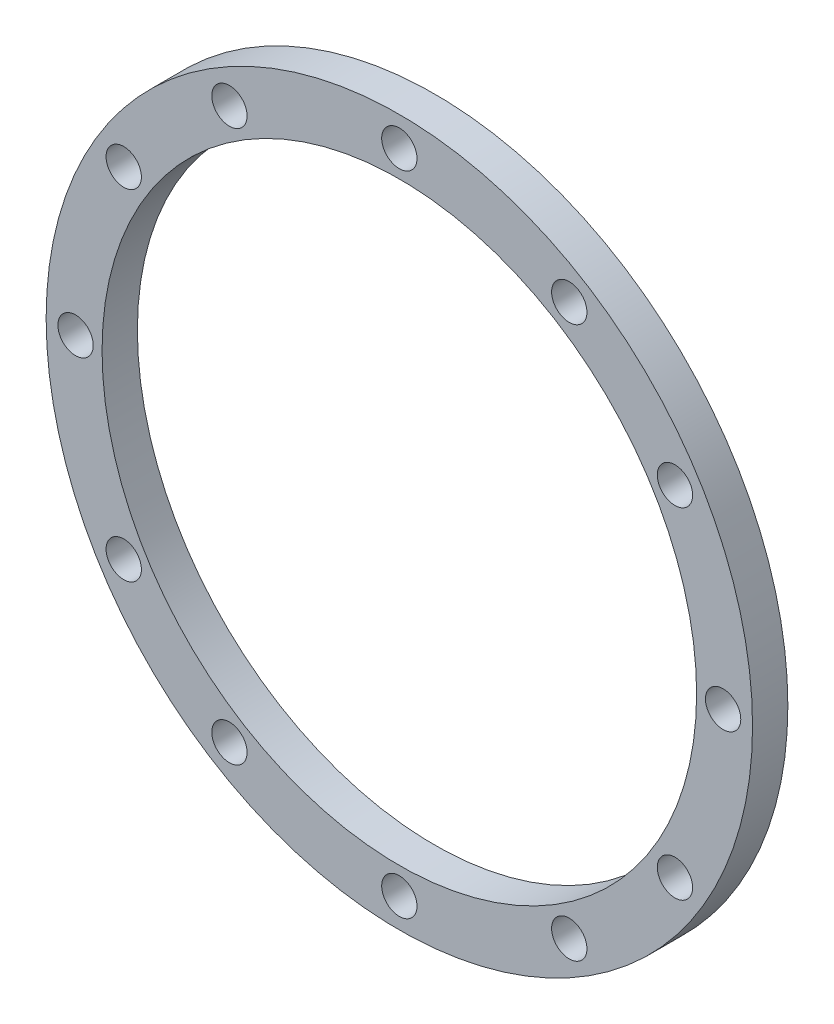
ISO-10303-21;
HEADER;
FILE_DESCRIPTION(('STEP AP214'),'2;1');
FILE_NAME('part.step','',(''),(''),'','','');
FILE_SCHEMA(('AUTOMOTIVE_DESIGN { 1 0 10303 214 1 1 1 1 }'));
ENDSEC;
DATA;
#1=APPLICATION_CONTEXT('core data for automotive mechanical design processes');
#2=APPLICATION_PROTOCOL_DEFINITION('international standard','automotive_design',2000,#1);
#3=PRODUCT_CONTEXT('',#1,'mechanical');
#4=PRODUCT('Part','Part','',(#3));
#5=PRODUCT_RELATED_PRODUCT_CATEGORY('part','',(#4));
#6=PRODUCT_DEFINITION_FORMATION('','',#4);
#7=PRODUCT_DEFINITION_CONTEXT('part definition',#1,'design');
#8=PRODUCT_DEFINITION('design','',#6,#7);
#9=PRODUCT_DEFINITION_SHAPE('','',#8);
#10=(LENGTH_UNIT() NAMED_UNIT(*) SI_UNIT(.MILLI.,.METRE.));
#11=(NAMED_UNIT(*) PLANE_ANGLE_UNIT() SI_UNIT($,.RADIAN.));
#12=(NAMED_UNIT(*) SI_UNIT($,.STERADIAN.) SOLID_ANGLE_UNIT());
#13=UNCERTAINTY_MEASURE_WITH_UNIT(LENGTH_MEASURE(1.E-05),#10,'distance_accuracy_value','');
#14=(GEOMETRIC_REPRESENTATION_CONTEXT(3) GLOBAL_UNCERTAINTY_ASSIGNED_CONTEXT((#13)) GLOBAL_UNIT_ASSIGNED_CONTEXT((#10,
#11,#12)) REPRESENTATION_CONTEXT('',''));
#15=CARTESIAN_POINT('',(0.,0.,0.));
#16=DIRECTION('',(0.,0.,1.));
#17=DIRECTION('',(1.,0.,0.));
#18=AXIS2_PLACEMENT_3D('',#15,#16,#17);
#19=CARTESIAN_POINT('',(0.,0.,30.));
#20=DIRECTION('',(0.,0.,1.));
#21=DIRECTION('',(1.,0.,0.));
#22=AXIS2_PLACEMENT_3D('',#19,#20,#21);
#23=PLANE('',#22);
#24=CARTESIAN_POINT('',(-234.090909090909,144.31370787625,30.));
#25=DIRECTION('',(0.,0.,1.));
#26=DIRECTION('',(1.,0.,0.));
#27=AXIS2_PLACEMENT_3D('',#24,#25,#26);
#28=CIRCLE('',#27,15.);
#29=CARTESIAN_POINT('',(-219.090909090909,144.31370787625,30.));
#30=VERTEX_POINT('',#29);
#31=EDGE_CURVE('E98',#30,#30,#28,.T.);
#32=ORIENTED_EDGE('',*,*,#31,.F.);
#33=EDGE_LOOP('',(#32));
#34=FACE_BOUND('',#33,.T.);
#35=CARTESIAN_POINT('',(144.31370787625,-234.090909090909,30.));
#36=DIRECTION('',(0.,0.,1.));
#37=DIRECTION('',(1.,0.,0.));
#38=AXIS2_PLACEMENT_3D('',#35,#36,#37);
#39=CIRCLE('',#38,15.);
#40=CARTESIAN_POINT('',(159.31370787625,-234.090909090909,30.));
#41=VERTEX_POINT('',#40);
#42=EDGE_CURVE('E92',#41,#41,#39,.T.);
#43=ORIENTED_EDGE('',*,*,#42,.F.);
#44=EDGE_LOOP('',(#43));
#45=FACE_BOUND('',#44,.T.);
#46=CARTESIAN_POINT('',(234.090909090909,-144.31370787625,30.));
#47=DIRECTION('',(0.,0.,1.));
#48=DIRECTION('',(1.,0.,0.));
#49=AXIS2_PLACEMENT_3D('',#46,#47,#48);
#50=CIRCLE('',#49,15.);
#51=CARTESIAN_POINT('',(249.090909090909,-144.31370787625,30.));
#52=VERTEX_POINT('',#51);
#53=EDGE_CURVE('E85',#52,#52,#50,.T.);
#54=ORIENTED_EDGE('',*,*,#53,.F.);
#55=EDGE_LOOP('',(#54));
#56=FACE_BOUND('',#55,.T.);
#57=CARTESIAN_POINT('',(234.090909090909,144.31370787625,30.));
#58=DIRECTION('',(0.,0.,1.));
#59=DIRECTION('',(1.,0.,0.));
#60=AXIS2_PLACEMENT_3D('',#57,#58,#59);
#61=CIRCLE('',#60,15.);
#62=CARTESIAN_POINT('',(249.090909090909,144.31370787625,30.));
#63=VERTEX_POINT('',#62);
#64=EDGE_CURVE('E115',#63,#63,#61,.T.);
#65=ORIENTED_EDGE('',*,*,#64,.F.);
#66=EDGE_LOOP('',(#65));
#67=FACE_BOUND('',#66,.T.);
#68=CARTESIAN_POINT('',(-144.31370787625,234.090909090909,30.));
#69=DIRECTION('',(0.,0.,1.));
#70=DIRECTION('',(1.,0.,0.));
#71=AXIS2_PLACEMENT_3D('',#68,#69,#70);
#72=CIRCLE('',#71,15.);
#73=CARTESIAN_POINT('',(-129.31370787625,234.090909090909,30.));
#74=VERTEX_POINT('',#73);
#75=EDGE_CURVE('E109',#74,#74,#72,.T.);
#76=ORIENTED_EDGE('',*,*,#75,.F.);
#77=EDGE_LOOP('',(#76));
#78=FACE_BOUND('',#77,.T.);
#79=CARTESIAN_POINT('',(144.31370787625,234.090909090909,30.));
#80=DIRECTION('',(0.,0.,1.));
#81=DIRECTION('',(1.,0.,0.));
#82=AXIS2_PLACEMENT_3D('',#79,#80,#81);
#83=CIRCLE('',#82,15.);
#84=CARTESIAN_POINT('',(159.31370787625,234.090909090909,30.));
#85=VERTEX_POINT('',#84);
#86=EDGE_CURVE('E103',#85,#85,#83,.T.);
#87=ORIENTED_EDGE('',*,*,#86,.F.);
#88=EDGE_LOOP('',(#87));
#89=FACE_BOUND('',#88,.T.);
#90=CARTESIAN_POINT('',(-234.090909090909,-144.31370787625,30.));
#91=DIRECTION('',(0.,0.,1.));
#92=DIRECTION('',(1.,0.,0.));
#93=AXIS2_PLACEMENT_3D('',#90,#91,#92);
#94=CIRCLE('',#93,15.);
#95=CARTESIAN_POINT('',(-219.090909090909,-144.31370787625,30.));
#96=VERTEX_POINT('',#95);
#97=EDGE_CURVE('E55',#96,#96,#94,.T.);
#98=ORIENTED_EDGE('',*,*,#97,.F.);
#99=EDGE_LOOP('',(#98));
#100=FACE_BOUND('',#99,.T.);
#101=CARTESIAN_POINT('',(-144.31370787625,-234.090909090909,30.));
#102=DIRECTION('',(0.,0.,1.));
#103=DIRECTION('',(1.,0.,0.));
#104=AXIS2_PLACEMENT_3D('',#101,#102,#103);
#105=CIRCLE('',#104,15.);
#106=CARTESIAN_POINT('',(-129.31370787625,-234.090909090909,30.));
#107=VERTEX_POINT('',#106);
#108=EDGE_CURVE('E62',#107,#107,#105,.T.);
#109=ORIENTED_EDGE('',*,*,#108,.F.);
#110=EDGE_LOOP('',(#109));
#111=FACE_BOUND('',#110,.T.);
#112=CARTESIAN_POINT('',(0.,-275.,30.));
#113=DIRECTION('',(0.,0.,1.));
#114=DIRECTION('',(1.,0.,0.));
#115=AXIS2_PLACEMENT_3D('',#112,#113,#114);
#116=CIRCLE('',#115,15.);
#117=CARTESIAN_POINT('',(15.,-275.,30.));
#118=VERTEX_POINT('',#117);
#119=EDGE_CURVE('E68',#118,#118,#116,.T.);
#120=ORIENTED_EDGE('',*,*,#119,.F.);
#121=EDGE_LOOP('',(#120));
#122=FACE_BOUND('',#121,.T.);
#123=CARTESIAN_POINT('',(-275.,0.,30.));
#124=DIRECTION('',(0.,0.,1.));
#125=DIRECTION('',(1.,0.,0.));
#126=AXIS2_PLACEMENT_3D('',#123,#124,#125);
#127=CIRCLE('',#126,15.);
#128=CARTESIAN_POINT('',(-260.,0.,30.));
#129=VERTEX_POINT('',#128);
#130=EDGE_CURVE('E74',#129,#129,#127,.T.);
#131=ORIENTED_EDGE('',*,*,#130,.F.);
#132=EDGE_LOOP('',(#131));
#133=FACE_BOUND('',#132,.T.);
#134=CARTESIAN_POINT('',(275.,0.,30.));
#135=DIRECTION('',(0.,0.,1.));
#136=DIRECTION('',(1.,0.,0.));
#137=AXIS2_PLACEMENT_3D('',#134,#135,#136);
#138=CIRCLE('',#137,15.);
#139=CARTESIAN_POINT('',(290.,0.,30.));
#140=VERTEX_POINT('',#139);
#141=EDGE_CURVE('E80',#140,#140,#138,.T.);
#142=ORIENTED_EDGE('',*,*,#141,.F.);
#143=EDGE_LOOP('',(#142));
#144=FACE_BOUND('',#143,.T.);
#145=CARTESIAN_POINT('',(0.,275.,30.));
#146=DIRECTION('',(0.,0.,1.));
#147=DIRECTION('',(1.,0.,0.));
#148=AXIS2_PLACEMENT_3D('',#145,#146,#147);
#149=CIRCLE('',#148,15.);
#150=CARTESIAN_POINT('',(15.,275.,30.));
#151=VERTEX_POINT('',#150);
#152=EDGE_CURVE('E49',#151,#151,#149,.T.);
#153=ORIENTED_EDGE('',*,*,#152,.F.);
#154=EDGE_LOOP('',(#153));
#155=FACE_BOUND('',#154,.T.);
#156=CARTESIAN_POINT('',(0.,0.,30.));
#157=DIRECTION('',(0.,0.,1.));
#158=DIRECTION('',(1.,0.,0.));
#159=AXIS2_PLACEMENT_3D('',#156,#157,#158);
#160=CIRCLE('',#159,300.);
#161=CARTESIAN_POINT('',(300.,0.,30.));
#162=VERTEX_POINT('',#161);
#163=EDGE_CURVE('E10',#162,#162,#160,.T.);
#164=ORIENTED_EDGE('',*,*,#163,.T.);
#165=EDGE_LOOP('',(#164));
#166=FACE_BOUND('',#165,.T.);
#167=CARTESIAN_POINT('',(0.,0.,30.));
#168=DIRECTION('',(0.,0.,1.));
#169=DIRECTION('',(1.,0.,0.));
#170=AXIS2_PLACEMENT_3D('',#167,#168,#169);
#171=CIRCLE('',#170,252.5);
#172=CARTESIAN_POINT('',(252.5,0.,30.));
#173=VERTEX_POINT('',#172);
#174=EDGE_CURVE('E41',#173,#173,#171,.T.);
#175=ORIENTED_EDGE('',*,*,#174,.F.);
#176=EDGE_LOOP('',(#175));
#177=FACE_BOUND('',#176,.T.);
#178=ADVANCED_FACE('F30',(#34,#45,#56,#67,#78,#89,#100,#111,#122,#133,#144,#155,#166,#177),#23,.T.);
#179=CARTESIAN_POINT('',(0.,0.,0.));
#180=DIRECTION('',(0.,0.,1.));
#181=DIRECTION('',(1.,0.,0.));
#182=AXIS2_PLACEMENT_3D('',#179,#180,#181);
#183=PLANE('',#182);
#184=CARTESIAN_POINT('',(-234.090909090909,144.31370787625,0.));
#185=DIRECTION('',(0.,0.,1.));
#186=DIRECTION('',(1.,0.,0.));
#187=AXIS2_PLACEMENT_3D('',#184,#185,#186);
#188=CIRCLE('',#187,15.);
#189=CARTESIAN_POINT('',(-219.090909090909,144.31370787625,0.));
#190=VERTEX_POINT('',#189);
#191=EDGE_CURVE('E59',#190,#190,#188,.T.);
#192=ORIENTED_EDGE('',*,*,#191,.T.);
#193=EDGE_LOOP('',(#192));
#194=FACE_BOUND('',#193,.T.);
#195=CARTESIAN_POINT('',(144.31370787625,-234.090909090909,0.));
#196=DIRECTION('',(0.,0.,1.));
#197=DIRECTION('',(1.,0.,0.));
#198=AXIS2_PLACEMENT_3D('',#195,#196,#197);
#199=CIRCLE('',#198,15.);
#200=CARTESIAN_POINT('',(159.31370787625,-234.090909090909,0.));
#201=VERTEX_POINT('',#200);
#202=EDGE_CURVE('E95',#201,#201,#199,.T.);
#203=ORIENTED_EDGE('',*,*,#202,.T.);
#204=EDGE_LOOP('',(#203));
#205=FACE_BOUND('',#204,.T.);
#206=CARTESIAN_POINT('',(234.090909090909,-144.31370787625,0.));
#207=DIRECTION('',(0.,0.,1.));
#208=DIRECTION('',(1.,0.,0.));
#209=AXIS2_PLACEMENT_3D('',#206,#207,#208);
#210=CIRCLE('',#209,15.);
#211=CARTESIAN_POINT('',(249.090909090909,-144.31370787625,0.));
#212=VERTEX_POINT('',#211);
#213=EDGE_CURVE('E88',#212,#212,#210,.T.);
#214=ORIENTED_EDGE('',*,*,#213,.T.);
#215=EDGE_LOOP('',(#214));
#216=FACE_BOUND('',#215,.T.);
#217=CARTESIAN_POINT('',(234.090909090909,144.31370787625,0.));
#218=DIRECTION('',(0.,0.,1.));
#219=DIRECTION('',(1.,0.,0.));
#220=AXIS2_PLACEMENT_3D('',#217,#218,#219);
#221=CIRCLE('',#220,15.);
#222=CARTESIAN_POINT('',(249.090909090909,144.31370787625,0.));
#223=VERTEX_POINT('',#222);
#224=EDGE_CURVE('E89',#223,#223,#221,.T.);
#225=ORIENTED_EDGE('',*,*,#224,.T.);
#226=EDGE_LOOP('',(#225));
#227=FACE_BOUND('',#226,.T.);
#228=CARTESIAN_POINT('',(-144.31370787625,234.090909090909,0.));
#229=DIRECTION('',(0.,0.,1.));
#230=DIRECTION('',(1.,0.,0.));
#231=AXIS2_PLACEMENT_3D('',#228,#229,#230);
#232=CIRCLE('',#231,15.);
#233=CARTESIAN_POINT('',(-129.31370787625,234.090909090909,0.));
#234=VERTEX_POINT('',#233);
#235=EDGE_CURVE('E112',#234,#234,#232,.T.);
#236=ORIENTED_EDGE('',*,*,#235,.T.);
#237=EDGE_LOOP('',(#236));
#238=FACE_BOUND('',#237,.T.);
#239=CARTESIAN_POINT('',(144.31370787625,234.090909090909,0.));
#240=DIRECTION('',(0.,0.,1.));
#241=DIRECTION('',(1.,0.,0.));
#242=AXIS2_PLACEMENT_3D('',#239,#240,#241);
#243=CIRCLE('',#242,15.);
#244=CARTESIAN_POINT('',(159.31370787625,234.090909090909,0.));
#245=VERTEX_POINT('',#244);
#246=EDGE_CURVE('E106',#245,#245,#243,.T.);
#247=ORIENTED_EDGE('',*,*,#246,.T.);
#248=EDGE_LOOP('',(#247));
#249=FACE_BOUND('',#248,.T.);
#250=CARTESIAN_POINT('',(-234.090909090909,-144.31370787625,0.));
#251=DIRECTION('',(0.,0.,1.));
#252=DIRECTION('',(1.,0.,0.));
#253=AXIS2_PLACEMENT_3D('',#250,#251,#252);
#254=CIRCLE('',#253,15.);
#255=CARTESIAN_POINT('',(-219.090909090909,-144.31370787625,0.));
#256=VERTEX_POINT('',#255);
#257=EDGE_CURVE('E58',#256,#256,#254,.T.);
#258=ORIENTED_EDGE('',*,*,#257,.T.);
#259=EDGE_LOOP('',(#258));
#260=FACE_BOUND('',#259,.T.);
#261=CARTESIAN_POINT('',(-144.31370787625,-234.090909090909,0.));
#262=DIRECTION('',(0.,0.,1.));
#263=DIRECTION('',(1.,0.,0.));
#264=AXIS2_PLACEMENT_3D('',#261,#262,#263);
#265=CIRCLE('',#264,15.);
#266=CARTESIAN_POINT('',(-129.31370787625,-234.090909090909,0.));
#267=VERTEX_POINT('',#266);
#268=EDGE_CURVE('E65',#267,#267,#265,.T.);
#269=ORIENTED_EDGE('',*,*,#268,.T.);
#270=EDGE_LOOP('',(#269));
#271=FACE_BOUND('',#270,.T.);
#272=CARTESIAN_POINT('',(0.,-275.,0.));
#273=DIRECTION('',(0.,0.,1.));
#274=DIRECTION('',(1.,0.,0.));
#275=AXIS2_PLACEMENT_3D('',#272,#273,#274);
#276=CIRCLE('',#275,15.);
#277=CARTESIAN_POINT('',(15.,-275.,0.));
#278=VERTEX_POINT('',#277);
#279=EDGE_CURVE('E71',#278,#278,#276,.T.);
#280=ORIENTED_EDGE('',*,*,#279,.T.);
#281=EDGE_LOOP('',(#280));
#282=FACE_BOUND('',#281,.T.);
#283=CARTESIAN_POINT('',(-275.,0.,0.));
#284=DIRECTION('',(0.,0.,1.));
#285=DIRECTION('',(1.,0.,0.));
#286=AXIS2_PLACEMENT_3D('',#283,#284,#285);
#287=CIRCLE('',#286,15.);
#288=CARTESIAN_POINT('',(-260.,0.,0.));
#289=VERTEX_POINT('',#288);
#290=EDGE_CURVE('E77',#289,#289,#287,.T.);
#291=ORIENTED_EDGE('',*,*,#290,.T.);
#292=EDGE_LOOP('',(#291));
#293=FACE_BOUND('',#292,.T.);
#294=CARTESIAN_POINT('',(275.,0.,0.));
#295=DIRECTION('',(0.,0.,1.));
#296=DIRECTION('',(1.,0.,0.));
#297=AXIS2_PLACEMENT_3D('',#294,#295,#296);
#298=CIRCLE('',#297,15.);
#299=CARTESIAN_POINT('',(290.,0.,0.));
#300=VERTEX_POINT('',#299);
#301=EDGE_CURVE('E52',#300,#300,#298,.T.);
#302=ORIENTED_EDGE('',*,*,#301,.T.);
#303=EDGE_LOOP('',(#302));
#304=FACE_BOUND('',#303,.T.);
#305=CARTESIAN_POINT('',(0.,275.,0.));
#306=DIRECTION('',(0.,0.,1.));
#307=DIRECTION('',(1.,0.,0.));
#308=AXIS2_PLACEMENT_3D('',#305,#306,#307);
#309=CIRCLE('',#308,15.);
#310=CARTESIAN_POINT('',(15.,275.,0.));
#311=VERTEX_POINT('',#310);
#312=EDGE_CURVE('E46',#311,#311,#309,.T.);
#313=ORIENTED_EDGE('',*,*,#312,.T.);
#314=EDGE_LOOP('',(#313));
#315=FACE_BOUND('',#314,.T.);
#316=CARTESIAN_POINT('',(0.,0.,0.));
#317=DIRECTION('',(0.,0.,1.));
#318=DIRECTION('',(1.,0.,0.));
#319=AXIS2_PLACEMENT_3D('',#316,#317,#318);
#320=CIRCLE('',#319,300.);
#321=CARTESIAN_POINT('',(300.,0.,0.));
#322=VERTEX_POINT('',#321);
#323=EDGE_CURVE('E34',#322,#322,#320,.T.);
#324=ORIENTED_EDGE('',*,*,#323,.F.);
#325=EDGE_LOOP('',(#324));
#326=FACE_BOUND('',#325,.T.);
#327=CARTESIAN_POINT('',(0.,0.,0.));
#328=DIRECTION('',(0.,0.,1.));
#329=DIRECTION('',(1.,0.,0.));
#330=AXIS2_PLACEMENT_3D('',#327,#328,#329);
#331=CIRCLE('',#330,252.5);
#332=CARTESIAN_POINT('',(252.5,0.,0.));
#333=VERTEX_POINT('',#332);
#334=EDGE_CURVE('E43',#333,#333,#331,.T.);
#335=ORIENTED_EDGE('',*,*,#334,.T.);
#336=EDGE_LOOP('',(#335));
#337=FACE_BOUND('',#336,.T.);
#338=ADVANCED_FACE('F121',(#194,#205,#216,#227,#238,#249,#260,#271,#282,#293,#304,#315,#326,
#337),#183,.F.);
#339=CARTESIAN_POINT('',(0.,0.,30.));
#340=DIRECTION('',(0.,0.,-1.));
#341=DIRECTION('',(-1.,0.,0.));
#342=AXIS2_PLACEMENT_3D('',#339,#340,#341);
#343=CYLINDRICAL_SURFACE('',#342,300.);
#344=ORIENTED_EDGE('',*,*,#163,.F.);
#345=EDGE_LOOP('',(#344));
#346=FACE_BOUND('',#345,.T.);
#347=ORIENTED_EDGE('',*,*,#323,.T.);
#348=EDGE_LOOP('',(#347));
#349=FACE_BOUND('',#348,.T.);
#350=ADVANCED_FACE('F32',(#346,#349),#343,.T.);
#351=CARTESIAN_POINT('',(0.,0.,30.));
#352=DIRECTION('',(0.,0.,-1.));
#353=DIRECTION('',(-1.,0.,0.));
#354=AXIS2_PLACEMENT_3D('',#351,#352,#353);
#355=CYLINDRICAL_SURFACE('',#354,252.5);
#356=ORIENTED_EDGE('',*,*,#174,.T.);
#357=EDGE_LOOP('',(#356));
#358=FACE_BOUND('',#357,.T.);
#359=ORIENTED_EDGE('',*,*,#334,.F.);
#360=EDGE_LOOP('',(#359));
#361=FACE_BOUND('',#360,.T.);
#362=ADVANCED_FACE('F154',(#358,#361),#355,.F.);
#363=CARTESIAN_POINT('',(0.,275.,0.));
#364=DIRECTION('',(0.,0.,1.));
#365=DIRECTION('',(1.,0.,0.));
#366=AXIS2_PLACEMENT_3D('',#363,#364,#365);
#367=CYLINDRICAL_SURFACE('',#366,15.);
#368=ORIENTED_EDGE('',*,*,#312,.F.);
#369=EDGE_LOOP('',(#368));
#370=FACE_BOUND('',#369,.T.);
#371=ORIENTED_EDGE('',*,*,#152,.T.);
#372=EDGE_LOOP('',(#371));
#373=FACE_BOUND('',#372,.T.);
#374=ADVANCED_FACE('F157',(#370,#373),#367,.F.);
#375=CARTESIAN_POINT('',(275.,0.,0.));
#376=DIRECTION('',(0.,0.,1.));
#377=DIRECTION('',(1.,0.,0.));
#378=AXIS2_PLACEMENT_3D('',#375,#376,#377);
#379=CYLINDRICAL_SURFACE('',#378,15.);
#380=ORIENTED_EDGE('',*,*,#301,.F.);
#381=EDGE_LOOP('',(#380));
#382=FACE_BOUND('',#381,.T.);
#383=ORIENTED_EDGE('',*,*,#141,.T.);
#384=EDGE_LOOP('',(#383));
#385=FACE_BOUND('',#384,.T.);
#386=ADVANCED_FACE('F171',(#382,#385),#379,.F.);
#387=CARTESIAN_POINT('',(-275.,0.,0.));
#388=DIRECTION('',(0.,0.,1.));
#389=DIRECTION('',(1.,0.,0.));
#390=AXIS2_PLACEMENT_3D('',#387,#388,#389);
#391=CYLINDRICAL_SURFACE('',#390,15.);
#392=ORIENTED_EDGE('',*,*,#290,.F.);
#393=EDGE_LOOP('',(#392));
#394=FACE_BOUND('',#393,.T.);
#395=ORIENTED_EDGE('',*,*,#130,.T.);
#396=EDGE_LOOP('',(#395));
#397=FACE_BOUND('',#396,.T.);
#398=ADVANCED_FACE('F185',(#394,#397),#391,.F.);
#399=CARTESIAN_POINT('',(0.,-275.,0.));
#400=DIRECTION('',(0.,0.,1.));
#401=DIRECTION('',(1.,0.,0.));
#402=AXIS2_PLACEMENT_3D('',#399,#400,#401);
#403=CYLINDRICAL_SURFACE('',#402,15.);
#404=ORIENTED_EDGE('',*,*,#279,.F.);
#405=EDGE_LOOP('',(#404));
#406=FACE_BOUND('',#405,.T.);
#407=ORIENTED_EDGE('',*,*,#119,.T.);
#408=EDGE_LOOP('',(#407));
#409=FACE_BOUND('',#408,.T.);
#410=ADVANCED_FACE('F181',(#406,#409),#403,.F.);
#411=CARTESIAN_POINT('',(-144.31370787625,-234.090909090909,0.));
#412=DIRECTION('',(0.,0.,1.));
#413=DIRECTION('',(1.,0.,0.));
#414=AXIS2_PLACEMENT_3D('',#411,#412,#413);
#415=CYLINDRICAL_SURFACE('',#414,15.);
#416=ORIENTED_EDGE('',*,*,#268,.F.);
#417=EDGE_LOOP('',(#416));
#418=FACE_BOUND('',#417,.T.);
#419=ORIENTED_EDGE('',*,*,#108,.T.);
#420=EDGE_LOOP('',(#419));
#421=FACE_BOUND('',#420,.T.);
#422=ADVANCED_FACE('F177',(#418,#421),#415,.F.);
#423=CARTESIAN_POINT('',(-234.090909090909,-144.31370787625,0.));
#424=DIRECTION('',(0.,0.,1.));
#425=DIRECTION('',(1.,0.,0.));
#426=AXIS2_PLACEMENT_3D('',#423,#424,#425);
#427=CYLINDRICAL_SURFACE('',#426,15.);
#428=ORIENTED_EDGE('',*,*,#257,.F.);
#429=EDGE_LOOP('',(#428));
#430=FACE_BOUND('',#429,.T.);
#431=ORIENTED_EDGE('',*,*,#97,.T.);
#432=EDGE_LOOP('',(#431));
#433=FACE_BOUND('',#432,.T.);
#434=ADVANCED_FACE('F173',(#430,#433),#427,.F.);
#435=CARTESIAN_POINT('',(144.31370787625,234.090909090909,0.));
#436=DIRECTION('',(0.,0.,1.));
#437=DIRECTION('',(1.,0.,0.));
#438=AXIS2_PLACEMENT_3D('',#435,#436,#437);
#439=CYLINDRICAL_SURFACE('',#438,15.);
#440=ORIENTED_EDGE('',*,*,#246,.F.);
#441=EDGE_LOOP('',(#440));
#442=FACE_BOUND('',#441,.T.);
#443=ORIENTED_EDGE('',*,*,#86,.T.);
#444=EDGE_LOOP('',(#443));
#445=FACE_BOUND('',#444,.T.);
#446=ADVANCED_FACE('F176',(#442,#445),#439,.F.);
#447=CARTESIAN_POINT('',(-144.31370787625,234.090909090909,0.));
#448=DIRECTION('',(0.,0.,1.));
#449=DIRECTION('',(1.,0.,0.));
#450=AXIS2_PLACEMENT_3D('',#447,#448,#449);
#451=CYLINDRICAL_SURFACE('',#450,15.);
#452=ORIENTED_EDGE('',*,*,#235,.F.);
#453=EDGE_LOOP('',(#452));
#454=FACE_BOUND('',#453,.T.);
#455=ORIENTED_EDGE('',*,*,#75,.T.);
#456=EDGE_LOOP('',(#455));
#457=FACE_BOUND('',#456,.T.);
#458=ADVANCED_FACE('F128',(#454,#457),#451,.F.);
#459=CARTESIAN_POINT('',(234.090909090909,144.31370787625,0.));
#460=DIRECTION('',(0.,0.,1.));
#461=DIRECTION('',(1.,0.,0.));
#462=AXIS2_PLACEMENT_3D('',#459,#460,#461);
#463=CYLINDRICAL_SURFACE('',#462,15.);
#464=ORIENTED_EDGE('',*,*,#224,.F.);
#465=EDGE_LOOP('',(#464));
#466=FACE_BOUND('',#465,.T.);
#467=ORIENTED_EDGE('',*,*,#64,.T.);
#468=EDGE_LOOP('',(#467));
#469=FACE_BOUND('',#468,.T.);
#470=ADVANCED_FACE('F124',(#466,#469),#463,.F.);
#471=CARTESIAN_POINT('',(234.090909090909,-144.31370787625,0.));
#472=DIRECTION('',(0.,0.,1.));
#473=DIRECTION('',(1.,0.,0.));
#474=AXIS2_PLACEMENT_3D('',#471,#472,#473);
#475=CYLINDRICAL_SURFACE('',#474,15.);
#476=ORIENTED_EDGE('',*,*,#213,.F.);
#477=EDGE_LOOP('',(#476));
#478=FACE_BOUND('',#477,.T.);
#479=ORIENTED_EDGE('',*,*,#53,.T.);
#480=EDGE_LOOP('',(#479));
#481=FACE_BOUND('',#480,.T.);
#482=ADVANCED_FACE('F127',(#478,#481),#475,.F.);
#483=CARTESIAN_POINT('',(144.31370787625,-234.090909090909,0.));
#484=DIRECTION('',(0.,0.,1.));
#485=DIRECTION('',(1.,0.,0.));
#486=AXIS2_PLACEMENT_3D('',#483,#484,#485);
#487=CYLINDRICAL_SURFACE('',#486,15.);
#488=ORIENTED_EDGE('',*,*,#202,.F.);
#489=EDGE_LOOP('',(#488));
#490=FACE_BOUND('',#489,.T.);
#491=ORIENTED_EDGE('',*,*,#42,.T.);
#492=EDGE_LOOP('',(#491));
#493=FACE_BOUND('',#492,.T.);
#494=ADVANCED_FACE('F195',(#490,#493),#487,.F.);
#495=CARTESIAN_POINT('',(-234.090909090909,144.31370787625,0.));
#496=DIRECTION('',(0.,0.,1.));
#497=DIRECTION('',(1.,0.,0.));
#498=AXIS2_PLACEMENT_3D('',#495,#496,#497);
#499=CYLINDRICAL_SURFACE('',#498,15.);
#500=ORIENTED_EDGE('',*,*,#191,.F.);
#501=EDGE_LOOP('',(#500));
#502=FACE_BOUND('',#501,.T.);
#503=ORIENTED_EDGE('',*,*,#31,.T.);
#504=EDGE_LOOP('',(#503));
#505=FACE_BOUND('',#504,.T.);
#506=ADVANCED_FACE('F199',(#502,#505),#499,.F.);
#507=CLOSED_SHELL('',(#178,#338,#350,#362,#374,#386,#398,#410,#422,#434,#446,#458,#470,#482,
#494,#506));
#508=MANIFOLD_SOLID_BREP('B2',#507);
#509=ADVANCED_BREP_SHAPE_REPRESENTATION('',(#18,#508),#14);
#510=SHAPE_DEFINITION_REPRESENTATION(#9,#509);
ENDSEC;
END-ISO-10303-21;
